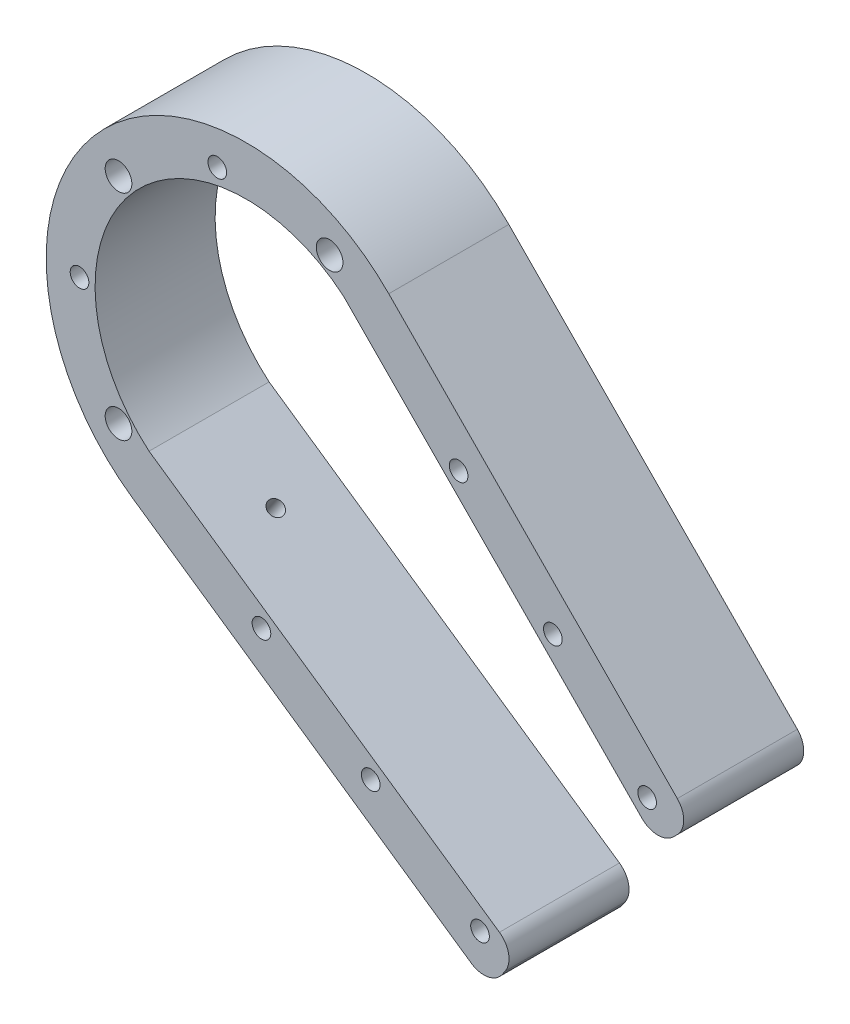
ISO-10303-21;
HEADER;
FILE_DESCRIPTION(('STEP AP214'),'2;1');
FILE_NAME('part.step','',(''),(''),'','','');
FILE_SCHEMA(('AUTOMOTIVE_DESIGN { 1 0 10303 214 1 1 1 1 }'));
ENDSEC;
DATA;
#1=APPLICATION_CONTEXT('core data for automotive mechanical design processes');
#2=APPLICATION_PROTOCOL_DEFINITION('international standard','automotive_design',2000,#1);
#3=PRODUCT_CONTEXT('',#1,'mechanical');
#4=PRODUCT('Part','Part','',(#3));
#5=PRODUCT_RELATED_PRODUCT_CATEGORY('part','',(#4));
#6=PRODUCT_DEFINITION_FORMATION('','',#4);
#7=PRODUCT_DEFINITION_CONTEXT('part definition',#1,'design');
#8=PRODUCT_DEFINITION('design','',#6,#7);
#9=PRODUCT_DEFINITION_SHAPE('','',#8);
#10=(LENGTH_UNIT() NAMED_UNIT(*) SI_UNIT(.MILLI.,.METRE.));
#11=(NAMED_UNIT(*) PLANE_ANGLE_UNIT() SI_UNIT($,.RADIAN.));
#12=(NAMED_UNIT(*) SI_UNIT($,.STERADIAN.) SOLID_ANGLE_UNIT());
#13=UNCERTAINTY_MEASURE_WITH_UNIT(LENGTH_MEASURE(1.E-05),#10,'distance_accuracy_value','');
#14=(GEOMETRIC_REPRESENTATION_CONTEXT(3) GLOBAL_UNCERTAINTY_ASSIGNED_CONTEXT((#13)) GLOBAL_UNIT_ASSIGNED_CONTEXT((#10,
#11,#12)) REPRESENTATION_CONTEXT('',''));
#15=CARTESIAN_POINT('',(0.,0.,0.));
#16=DIRECTION('',(0.,0.,1.));
#17=DIRECTION('',(1.,0.,0.));
#18=AXIS2_PLACEMENT_3D('',#15,#16,#17);
#19=CARTESIAN_POINT('',(18.75,32.4759526419165,9.999));
#20=DIRECTION('',(0.,0.,1.));
#21=DIRECTION('',(1.,0.,0.));
#22=AXIS2_PLACEMENT_3D('',#19,#20,#21);
#23=CYLINDRICAL_SURFACE('',#22,2.1);
#24=CARTESIAN_POINT('',(18.75,32.4759526419165,10.));
#25=DIRECTION('',(0.,0.,1.));
#26=DIRECTION('',(1.,0.,0.));
#27=AXIS2_PLACEMENT_3D('',#24,#25,#26);
#28=CIRCLE('',#27,2.1);
#29=CARTESIAN_POINT('',(20.85,32.4759526419165,10.));
#30=VERTEX_POINT('',#29);
#31=EDGE_CURVE('E273',#30,#30,#28,.F.);
#32=ORIENTED_EDGE('',*,*,#31,.T.);
#33=EDGE_LOOP('',(#32));
#34=FACE_BOUND('',#33,.T.);
#35=CARTESIAN_POINT('',(18.75,32.4759526419165,22.));
#36=DIRECTION('',(0.,0.,1.));
#37=DIRECTION('',(1.,0.,0.));
#38=AXIS2_PLACEMENT_3D('',#35,#36,#37);
#39=CIRCLE('',#38,2.1);
#40=CARTESIAN_POINT('',(20.85,32.4759526419165,22.));
#41=VERTEX_POINT('',#40);
#42=EDGE_CURVE('E45',#41,#41,#39,.F.);
#43=ORIENTED_EDGE('',*,*,#42,.F.);
#44=EDGE_LOOP('',(#43));
#45=FACE_BOUND('',#44,.T.);
#46=ADVANCED_FACE('F41',(#34,#45),#23,.F.);
#47=CARTESIAN_POINT('',(-28.7266666169617,24.1045353632452,9.999));
#48=DIRECTION('',(0.,0.,1.));
#49=DIRECTION('',(1.,0.,0.));
#50=AXIS2_PLACEMENT_3D('',#47,#48,#49);
#51=CYLINDRICAL_SURFACE('',#50,2.1);
#52=CARTESIAN_POINT('',(-28.7266666169617,24.1045353632452,10.));
#53=DIRECTION('',(0.,0.,1.));
#54=DIRECTION('',(1.,0.,0.));
#55=AXIS2_PLACEMENT_3D('',#52,#53,#54);
#56=CIRCLE('',#55,2.1);
#57=CARTESIAN_POINT('',(-26.6266666169617,24.1045353632452,10.));
#58=VERTEX_POINT('',#57);
#59=EDGE_CURVE('E264',#58,#58,#56,.F.);
#60=ORIENTED_EDGE('',*,*,#59,.T.);
#61=EDGE_LOOP('',(#60));
#62=FACE_BOUND('',#61,.T.);
#63=CARTESIAN_POINT('',(-28.7266666169617,24.1045353632452,22.));
#64=DIRECTION('',(0.,0.,1.));
#65=DIRECTION('',(1.,0.,0.));
#66=AXIS2_PLACEMENT_3D('',#63,#64,#65);
#67=CIRCLE('',#66,2.1);
#68=CARTESIAN_POINT('',(-26.6266666169617,24.1045353632452,22.));
#69=VERTEX_POINT('',#68);
#70=EDGE_CURVE('E213',#69,#69,#67,.F.);
#71=ORIENTED_EDGE('',*,*,#70,.F.);
#72=EDGE_LOOP('',(#71));
#73=FACE_BOUND('',#72,.T.);
#74=ADVANCED_FACE('F340',(#62,#73),#51,.F.);
#75=CARTESIAN_POINT('',(-28.7266666169617,-24.1045353632452,9.999));
#76=DIRECTION('',(0.,0.,1.));
#77=DIRECTION('',(1.,0.,0.));
#78=AXIS2_PLACEMENT_3D('',#75,#76,#77);
#79=CYLINDRICAL_SURFACE('',#78,2.1);
#80=CARTESIAN_POINT('',(-28.7266666169617,-24.1045353632452,10.));
#81=DIRECTION('',(0.,0.,1.));
#82=DIRECTION('',(1.,0.,0.));
#83=AXIS2_PLACEMENT_3D('',#80,#81,#82);
#84=CIRCLE('',#83,2.1);
#85=CARTESIAN_POINT('',(-26.6266666169617,-24.1045353632452,10.));
#86=VERTEX_POINT('',#85);
#87=EDGE_CURVE('E255',#86,#86,#84,.F.);
#88=ORIENTED_EDGE('',*,*,#87,.T.);
#89=EDGE_LOOP('',(#88));
#90=FACE_BOUND('',#89,.T.);
#91=CARTESIAN_POINT('',(-28.7266666169617,-24.1045353632452,22.));
#92=DIRECTION('',(0.,0.,1.));
#93=DIRECTION('',(1.,0.,0.));
#94=AXIS2_PLACEMENT_3D('',#91,#92,#93);
#95=CIRCLE('',#94,2.1);
#96=CARTESIAN_POINT('',(-26.6266666169617,-24.1045353632452,22.));
#97=VERTEX_POINT('',#96);
#98=EDGE_CURVE('E211',#97,#97,#95,.F.);
#99=ORIENTED_EDGE('',*,*,#98,.F.);
#100=EDGE_LOOP('',(#99));
#101=FACE_BOUND('',#100,.T.);
#102=ADVANCED_FACE('F347',(#90,#101),#79,.F.);
#103=CARTESIAN_POINT('',(65.0622498431254,67.977292113235,23.5));
#104=DIRECTION('',(-0.567441607867893,-0.823413639467006,0.));
#105=DIRECTION('',(0.823413639467006,-0.567441607867893,0.));
#106=AXIS2_PLACEMENT_3D('',#103,#104,#105);
#107=CYLINDRICAL_SURFACE('',#106,1.7);
#108=CARTESIAN_POINT('',(-6.85529783742989,-36.3821500850441,23.5));
#109=DIRECTION('',(-0.567441607867893,-0.823413639467006,0.));
#110=DIRECTION('',(0.823413639467006,-0.567441607867893,0.));
#111=AXIS2_PLACEMENT_3D('',#108,#109,#110);
#112=CIRCLE('',#111,1.7);
#113=CARTESIAN_POINT('',(-5.45549465033598,-37.3468008184196,23.5));
#114=VERTEX_POINT('',#113);
#115=EDGE_CURVE('E235',#114,#114,#112,.F.);
#116=ORIENTED_EDGE('',*,*,#115,.T.);
#117=EDGE_LOOP('',(#116));
#118=FACE_BOUND('',#117,.T.);
#119=CARTESIAN_POINT('',(-11.4813429384464,-43.0949969756327,23.5));
#120=DIRECTION('',(-0.567441607867893,-0.823413639467006,0.));
#121=DIRECTION('',(0.823413639467006,-0.567441607867893,0.));
#122=AXIS2_PLACEMENT_3D('',#119,#120,#121);
#123=CIRCLE('',#122,1.7);
#124=CARTESIAN_POINT('',(-10.0815397513525,-44.0596477090081,23.5));
#125=VERTEX_POINT('',#124);
#126=EDGE_CURVE('E219',#125,#125,#123,.T.);
#127=ORIENTED_EDGE('',*,*,#126,.T.);
#128=EDGE_LOOP('',(#127));
#129=FACE_BOUND('',#128,.T.);
#130=ADVANCED_FACE('F362',(#118,#129),#107,.F.);
#131=CARTESIAN_POINT('',(0.,0.,37.));
#132=DIRECTION('',(0.,0.,1.));
#133=DIRECTION('',(1.,0.,0.));
#134=AXIS2_PLACEMENT_3D('',#131,#132,#133);
#135=PLANE('',#134);
#136=CARTESIAN_POINT('',(18.75,32.4759526419165,37.));
#137=DIRECTION('',(0.,0.,1.));
#138=DIRECTION('',(1.,0.,0.));
#139=AXIS2_PLACEMENT_3D('',#136,#137,#138);
#140=CIRCLE('',#139,3.);
#141=CARTESIAN_POINT('',(21.75,32.4759526419165,37.));
#142=VERTEX_POINT('',#141);
#143=EDGE_CURVE('E466',#142,#142,#140,.T.);
#144=ORIENTED_EDGE('',*,*,#143,.F.);
#145=EDGE_LOOP('',(#144));
#146=FACE_BOUND('',#145,.T.);
#147=CARTESIAN_POINT('',(-28.7266666169617,24.1045353632452,37.));
#148=DIRECTION('',(0.,0.,1.));
#149=DIRECTION('',(1.,0.,0.));
#150=AXIS2_PLACEMENT_3D('',#147,#148,#149);
#151=CIRCLE('',#150,3.);
#152=CARTESIAN_POINT('',(-25.7266666169617,24.1045353632452,37.));
#153=VERTEX_POINT('',#152);
#154=EDGE_CURVE('E469',#153,#153,#151,.T.);
#155=ORIENTED_EDGE('',*,*,#154,.F.);
#156=EDGE_LOOP('',(#155));
#157=FACE_BOUND('',#156,.T.);
#158=CARTESIAN_POINT('',(-28.7266666169617,-24.1045353632452,37.));
#159=DIRECTION('',(0.,0.,1.));
#160=DIRECTION('',(1.,0.,0.));
#161=AXIS2_PLACEMENT_3D('',#158,#159,#160);
#162=CIRCLE('',#161,3.);
#163=CARTESIAN_POINT('',(-25.7266666169617,-24.1045353632452,37.));
#164=VERTEX_POINT('',#163);
#165=EDGE_CURVE('E476',#164,#164,#162,.T.);
#166=ORIENTED_EDGE('',*,*,#165,.F.);
#167=EDGE_LOOP('',(#166));
#168=FACE_BOUND('',#167,.T.);
#169=CARTESIAN_POINT('',(52.5843615175951,-82.298859012041,37.));
#170=DIRECTION('',(0.,0.,1.));
#171=DIRECTION('',(1.,0.,0.));
#172=AXIS2_PLACEMENT_3D('',#169,#170,#171);
#173=CIRCLE('',#172,2.1);
#174=CARTESIAN_POINT('',(54.6843615175951,-82.298859012041,37.));
#175=VERTEX_POINT('',#174);
#176=EDGE_CURVE('E240',#175,#175,#173,.T.);
#177=ORIENTED_EDGE('',*,*,#176,.F.);
#178=EDGE_LOOP('',(#177));
#179=FACE_BOUND('',#178,.T.);
#180=CARTESIAN_POINT('',(28.0038552032799,-65.1000593640451,37.));
#181=DIRECTION('',(0.,0.,1.));
#182=DIRECTION('',(1.,0.,0.));
#183=AXIS2_PLACEMENT_3D('',#180,#181,#182);
#184=CIRCLE('',#183,2.1);
#185=CARTESIAN_POINT('',(30.1038552032799,-65.1000593640451,37.));
#186=VERTEX_POINT('',#185);
#187=EDGE_CURVE('E243',#186,#186,#184,.T.);
#188=ORIENTED_EDGE('',*,*,#187,.F.);
#189=EDGE_LOOP('',(#188));
#190=FACE_BOUND('',#189,.T.);
#191=CARTESIAN_POINT('',(3.42334888896434,-47.9012597160495,37.));
#192=DIRECTION('',(0.,0.,1.));
#193=DIRECTION('',(1.,0.,0.));
#194=AXIS2_PLACEMENT_3D('',#191,#192,#193);
#195=CIRCLE('',#194,2.1);
#196=CARTESIAN_POINT('',(5.52334888896434,-47.9012597160495,37.));
#197=VERTEX_POINT('',#196);
#198=EDGE_CURVE('E249',#197,#197,#195,.T.);
#199=ORIENTED_EDGE('',*,*,#198,.F.);
#200=EDGE_LOOP('',(#199));
#201=FACE_BOUND('',#200,.T.);
#202=CARTESIAN_POINT('',(-37.5,0.,37.));
#203=DIRECTION('',(0.,0.,1.));
#204=DIRECTION('',(1.,0.,0.));
#205=AXIS2_PLACEMENT_3D('',#202,#203,#204);
#206=CIRCLE('',#205,2.1);
#207=CARTESIAN_POINT('',(-35.4,0.,37.));
#208=VERTEX_POINT('',#207);
#209=EDGE_CURVE('E260',#208,#208,#206,.T.);
#210=ORIENTED_EDGE('',*,*,#209,.F.);
#211=EDGE_LOOP('',(#210));
#212=FACE_BOUND('',#211,.T.);
#213=CARTESIAN_POINT('',(-6.51180666250989,36.9302907379578,37.));
#214=DIRECTION('',(0.,0.,1.));
#215=DIRECTION('',(1.,0.,0.));
#216=AXIS2_PLACEMENT_3D('',#213,#214,#215);
#217=CIRCLE('',#216,2.1);
#218=CARTESIAN_POINT('',(-4.41180666250989,36.9302907379578,37.));
#219=VERTEX_POINT('',#218);
#220=EDGE_CURVE('E269',#219,#219,#217,.T.);
#221=ORIENTED_EDGE('',*,*,#220,.F.);
#222=EDGE_LOOP('',(#221));
#223=FACE_BOUND('',#222,.T.);
#224=CARTESIAN_POINT('',(47.7679902435036,4.94662593052469,37.));
#225=DIRECTION('',(0.,0.,1.));
#226=DIRECTION('',(1.,0.,0.));
#227=AXIS2_PLACEMENT_3D('',#224,#225,#226);
#228=CIRCLE('',#227,2.1);
#229=CARTESIAN_POINT('',(49.8679902435036,4.94662593052469,37.));
#230=VERTEX_POINT('',#229);
#231=EDGE_CURVE('E278',#230,#230,#228,.T.);
#232=ORIENTED_EDGE('',*,*,#231,.F.);
#233=EDGE_LOOP('',(#232));
#234=FACE_BOUND('',#233,.T.);
#235=CARTESIAN_POINT('',(68.9738616069648,-16.2739070438456,37.));
#236=DIRECTION('',(0.,0.,1.));
#237=DIRECTION('',(1.,0.,0.));
#238=AXIS2_PLACEMENT_3D('',#235,#236,#237);
#239=CIRCLE('',#238,2.1);
#240=CARTESIAN_POINT('',(71.0738616069648,-16.2739070438456,37.));
#241=VERTEX_POINT('',#240);
#242=EDGE_CURVE('E282',#241,#241,#239,.T.);
#243=ORIENTED_EDGE('',*,*,#242,.F.);
#244=EDGE_LOOP('',(#243));
#245=FACE_BOUND('',#244,.T.);
#246=CARTESIAN_POINT('',(90.1797329704259,-37.4944400182162,37.));
#247=DIRECTION('',(0.,0.,1.));
#248=DIRECTION('',(1.,0.,0.));
#249=AXIS2_PLACEMENT_3D('',#246,#247,#248);
#250=CIRCLE('',#249,2.1);
#251=CARTESIAN_POINT('',(92.2797329704259,-37.4944400182162,37.));
#252=VERTEX_POINT('',#251);
#253=EDGE_CURVE('E288',#252,#252,#250,.T.);
#254=ORIENTED_EDGE('',*,*,#253,.F.);
#255=EDGE_LOOP('',(#254));
#256=FACE_BOUND('',#255,.T.);
#257=CARTESIAN_POINT('',(0.,0.,37.));
#258=DIRECTION('',(0.,0.,1.));
#259=DIRECTION('',(1.,0.,0.));
#260=AXIS2_PLACEMENT_3D('',#257,#258,#259);
#261=CIRCLE('',#260,45.);
#262=CARTESIAN_POINT('',(32.0566020725005,31.5812327746298,37.));
#263=VERTEX_POINT('',#262);
#264=CARTESIAN_POINT('',(-25.5348723540551,-37.0536137760153,37.));
#265=VERTEX_POINT('',#264);
#266=EDGE_CURVE('E187',#263,#265,#261,.T.);
#267=ORIENTED_EDGE('',*,*,#266,.T.);
#268=DIRECTION('',(0.823413639467006,-0.567441607867893,0.));
#269=VECTOR('',#268,1.);
#270=CARTESIAN_POINT('',(-25.5348723540551,-37.0536137760153,37.));
#271=LINE('',#270,#269);
#272=CARTESIAN_POINT('',(50.6195975492525,-89.5341809867209,37.));
#273=VERTEX_POINT('',#272);
#274=EDGE_CURVE('E115',#265,#273,#271,.T.);
#275=ORIENTED_EDGE('',*,*,#274,.T.);
#276=CARTESIAN_POINT('',(53.456805588592,-85.4171127893859,37.));
#277=DIRECTION('',(0.,0.,1.));
#278=DIRECTION('',(1.,0.,0.));
#279=AXIS2_PLACEMENT_3D('',#276,#277,#278);
#280=CIRCLE('',#279,5.);
#281=CARTESIAN_POINT('',(57.573873785927,-88.2543208287254,37.));
#282=VERTEX_POINT('',#281);
#283=EDGE_CURVE('E297',#273,#282,#280,.T.);
#284=ORIENTED_EDGE('',*,*,#283,.T.);
#285=DIRECTION('',(0.567441607867889,0.823413639467008,0.));
#286=VECTOR('',#285,1.);
#287=CARTESIAN_POINT('',(58.2278276318683,-87.3053694144059,37.));
#288=LINE('',#287,#286);
#289=CARTESIAN_POINT('',(58.2278276318683,-87.3053694144059,37.));
#290=VERTEX_POINT('',#289);
#291=EDGE_CURVE('E299',#282,#290,#288,.T.);
#292=ORIENTED_EDGE('',*,*,#291,.T.);
#293=CARTESIAN_POINT('',(54.1107594345333,-84.4681613750665,37.));
#294=DIRECTION('',(0.,0.,1.));
#295=DIRECTION('',(-1.,0.,0.));
#296=AXIS2_PLACEMENT_3D('',#293,#294,#295);
#297=CIRCLE('',#296,5.);
#298=CARTESIAN_POINT('',(56.9479674738727,-80.3510931777314,37.));
#299=VERTEX_POINT('',#298);
#300=EDGE_CURVE('E301',#290,#299,#297,.T.);
#301=ORIENTED_EDGE('',*,*,#300,.T.);
#302=DIRECTION('',(-0.823413639467006,0.567441607867893,0.));
#303=VECTOR('',#302,1.);
#304=CARTESIAN_POINT('',(-21.8547787293424,-26.0455110660452,37.));
#305=LINE('',#304,#303);
#306=CARTESIAN_POINT('',(-21.8547787293424,-26.0455110660452,37.));
#307=VERTEX_POINT('',#306);
#308=EDGE_CURVE('E303',#299,#307,#305,.T.);
#309=ORIENTED_EDGE('',*,*,#308,.T.);
#310=CARTESIAN_POINT('',(0.,0.,37.));
#311=DIRECTION('',(0.,0.,-1.));
#312=DIRECTION('',(1.,0.,0.));
#313=AXIS2_PLACEMENT_3D('',#310,#311,#312);
#314=CIRCLE('',#313,34.);
#315=CARTESIAN_POINT('',(21.8547787293424,26.0455110660452,37.));
#316=VERTEX_POINT('',#315);
#317=EDGE_CURVE('E305',#307,#316,#314,.T.);
#318=ORIENTED_EDGE('',*,*,#317,.T.);
#319=DIRECTION('',(0.701805172769552,-0.712368934944456,0.));
#320=VECTOR('',#319,1.);
#321=CARTESIAN_POINT('',(21.8547787293424,26.0455110660452,37.));
#322=LINE('',#321,#320);
#323=CARTESIAN_POINT('',(89.0192902981097,-42.1299789826984,37.));
#324=VERTEX_POINT('',#323);
#325=EDGE_CURVE('E307',#316,#324,#322,.T.);
#326=ORIENTED_EDGE('',*,*,#325,.T.);
#327=CARTESIAN_POINT('',(92.581134972832,-38.6209531188506,37.));
#328=DIRECTION('',(0.,0.,1.));
#329=DIRECTION('',(1.,0.,0.));
#330=AXIS2_PLACEMENT_3D('',#327,#328,#329);
#331=CIRCLE('',#330,5.);
#332=CARTESIAN_POINT('',(96.0901608366797,-42.1827977935729,37.));
#333=VERTEX_POINT('',#332);
#334=EDGE_CURVE('E146',#324,#333,#331,.T.);
#335=ORIENTED_EDGE('',*,*,#334,.T.);
#336=DIRECTION('',(0.712368934944457,0.701805172769552,0.));
#337=VECTOR('',#336,1.);
#338=CARTESIAN_POINT('',(96.9111376531075,-41.3739952921868,37.));
#339=LINE('',#338,#337);
#340=CARTESIAN_POINT('',(96.9111376531075,-41.3739952921867,37.));
#341=VERTEX_POINT('',#340);
#342=EDGE_CURVE('E140',#333,#341,#339,.T.);
#343=ORIENTED_EDGE('',*,*,#342,.T.);
#344=CARTESIAN_POINT('',(93.4021117892597,-37.8121506174645,37.));
#345=DIRECTION('',(0.,0.,1.));
#346=DIRECTION('',(1.,0.,0.));
#347=AXIS2_PLACEMENT_3D('',#344,#345,#346);
#348=CIRCLE('',#347,5.);
#349=CARTESIAN_POINT('',(96.963956463982,-34.3031247536167,37.));
#350=VERTEX_POINT('',#349);
#351=EDGE_CURVE('E144',#341,#350,#348,.T.);
#352=ORIENTED_EDGE('',*,*,#351,.T.);
#353=DIRECTION('',(-0.701805172769552,0.712368934944456,0.));
#354=VECTOR('',#353,1.);
#355=CARTESIAN_POINT('',(32.0566020725005,31.5812327746298,37.));
#356=LINE('',#355,#354);
#357=EDGE_CURVE('E60',#350,#263,#356,.T.);
#358=ORIENTED_EDGE('',*,*,#357,.T.);
#359=EDGE_LOOP('',(#267,#275,#284,#292,#301,#309,#318,#326,#335,#343,#352,#358));
#360=FACE_BOUND('',#359,.T.);
#361=ADVANCED_FACE('F142',(#146,#157,#168,#179,#190,#201,#212,#223,#234,#245,#256,#360),#135,.T.);
#362=CARTESIAN_POINT('',(0.,0.,10.));
#363=DIRECTION('',(0.,0.,1.));
#364=DIRECTION('',(1.,0.,0.));
#365=AXIS2_PLACEMENT_3D('',#362,#363,#364);
#366=PLANE('',#365);
#367=CARTESIAN_POINT('',(52.5843615175951,-82.298859012041,10.));
#368=DIRECTION('',(0.,0.,1.));
#369=DIRECTION('',(1.,0.,0.));
#370=AXIS2_PLACEMENT_3D('',#367,#368,#369);
#371=CIRCLE('',#370,2.1);
#372=CARTESIAN_POINT('',(54.6843615175951,-82.298859012041,10.));
#373=VERTEX_POINT('',#372);
#374=EDGE_CURVE('E168',#373,#373,#371,.F.);
#375=ORIENTED_EDGE('',*,*,#374,.F.);
#376=EDGE_LOOP('',(#375));
#377=FACE_BOUND('',#376,.T.);
#378=CARTESIAN_POINT('',(28.0038552032799,-65.1000593640451,10.));
#379=DIRECTION('',(0.,0.,1.));
#380=DIRECTION('',(1.,0.,0.));
#381=AXIS2_PLACEMENT_3D('',#378,#379,#380);
#382=CIRCLE('',#381,2.1);
#383=CARTESIAN_POINT('',(30.1038552032799,-65.1000593640451,10.));
#384=VERTEX_POINT('',#383);
#385=EDGE_CURVE('E246',#384,#384,#382,.F.);
#386=ORIENTED_EDGE('',*,*,#385,.F.);
#387=EDGE_LOOP('',(#386));
#388=FACE_BOUND('',#387,.T.);
#389=CARTESIAN_POINT('',(3.42334888896434,-47.9012597160495,10.));
#390=DIRECTION('',(0.,0.,1.));
#391=DIRECTION('',(1.,0.,0.));
#392=AXIS2_PLACEMENT_3D('',#389,#390,#391);
#393=CIRCLE('',#392,2.1);
#394=CARTESIAN_POINT('',(5.52334888896434,-47.9012597160495,10.));
#395=VERTEX_POINT('',#394);
#396=EDGE_CURVE('E252',#395,#395,#393,.F.);
#397=ORIENTED_EDGE('',*,*,#396,.F.);
#398=EDGE_LOOP('',(#397));
#399=FACE_BOUND('',#398,.T.);
#400=ORIENTED_EDGE('',*,*,#87,.F.);
#401=EDGE_LOOP('',(#400));
#402=FACE_BOUND('',#401,.T.);
#403=CARTESIAN_POINT('',(-37.5,0.,10.));
#404=DIRECTION('',(0.,0.,1.));
#405=DIRECTION('',(1.,0.,0.));
#406=AXIS2_PLACEMENT_3D('',#403,#404,#405);
#407=CIRCLE('',#406,2.1);
#408=CARTESIAN_POINT('',(-35.4,0.,10.));
#409=VERTEX_POINT('',#408);
#410=EDGE_CURVE('E261',#409,#409,#407,.F.);
#411=ORIENTED_EDGE('',*,*,#410,.F.);
#412=EDGE_LOOP('',(#411));
#413=FACE_BOUND('',#412,.T.);
#414=ORIENTED_EDGE('',*,*,#59,.F.);
#415=EDGE_LOOP('',(#414));
#416=FACE_BOUND('',#415,.T.);
#417=CARTESIAN_POINT('',(-6.51180666250989,36.9302907379578,10.));
#418=DIRECTION('',(0.,0.,1.));
#419=DIRECTION('',(1.,0.,0.));
#420=AXIS2_PLACEMENT_3D('',#417,#418,#419);
#421=CIRCLE('',#420,2.1);
#422=CARTESIAN_POINT('',(-4.41180666250989,36.9302907379578,10.));
#423=VERTEX_POINT('',#422);
#424=EDGE_CURVE('E270',#423,#423,#421,.F.);
#425=ORIENTED_EDGE('',*,*,#424,.F.);
#426=EDGE_LOOP('',(#425));
#427=FACE_BOUND('',#426,.T.);
#428=ORIENTED_EDGE('',*,*,#31,.F.);
#429=EDGE_LOOP('',(#428));
#430=FACE_BOUND('',#429,.T.);
#431=CARTESIAN_POINT('',(47.7679902435036,4.94662593052469,10.));
#432=DIRECTION('',(0.,0.,1.));
#433=DIRECTION('',(1.,0.,0.));
#434=AXIS2_PLACEMENT_3D('',#431,#432,#433);
#435=CIRCLE('',#434,2.1);
#436=CARTESIAN_POINT('',(49.8679902435036,4.94662593052469,10.));
#437=VERTEX_POINT('',#436);
#438=EDGE_CURVE('E279',#437,#437,#435,.F.);
#439=ORIENTED_EDGE('',*,*,#438,.F.);
#440=EDGE_LOOP('',(#439));
#441=FACE_BOUND('',#440,.T.);
#442=CARTESIAN_POINT('',(68.9738616069648,-16.2739070438456,10.));
#443=DIRECTION('',(0.,0.,1.));
#444=DIRECTION('',(1.,0.,0.));
#445=AXIS2_PLACEMENT_3D('',#442,#443,#444);
#446=CIRCLE('',#445,2.1);
#447=CARTESIAN_POINT('',(71.0738616069648,-16.2739070438456,10.));
#448=VERTEX_POINT('',#447);
#449=EDGE_CURVE('E285',#448,#448,#446,.F.);
#450=ORIENTED_EDGE('',*,*,#449,.F.);
#451=EDGE_LOOP('',(#450));
#452=FACE_BOUND('',#451,.T.);
#453=CARTESIAN_POINT('',(90.1797329704259,-37.4944400182162,10.));
#454=DIRECTION('',(0.,0.,1.));
#455=DIRECTION('',(1.,0.,0.));
#456=AXIS2_PLACEMENT_3D('',#453,#454,#455);
#457=CIRCLE('',#456,2.1);
#458=CARTESIAN_POINT('',(92.2797329704259,-37.4944400182162,10.));
#459=VERTEX_POINT('',#458);
#460=EDGE_CURVE('E239',#459,#459,#457,.F.);
#461=ORIENTED_EDGE('',*,*,#460,.F.);
#462=EDGE_LOOP('',(#461));
#463=FACE_BOUND('',#462,.T.);
#464=CARTESIAN_POINT('',(0.,0.,10.));
#465=DIRECTION('',(0.,0.,1.));
#466=DIRECTION('',(1.,0.,0.));
#467=AXIS2_PLACEMENT_3D('',#464,#465,#466);
#468=CIRCLE('',#467,45.);
#469=CARTESIAN_POINT('',(32.0566020725005,31.5812327746298,10.));
#470=VERTEX_POINT('',#469);
#471=CARTESIAN_POINT('',(-25.5348723540551,-37.0536137760153,10.));
#472=VERTEX_POINT('',#471);
#473=EDGE_CURVE('E164',#470,#472,#468,.T.);
#474=ORIENTED_EDGE('',*,*,#473,.F.);
#475=DIRECTION('',(-0.701805172769552,0.712368934944456,0.));
#476=VECTOR('',#475,1.);
#477=CARTESIAN_POINT('',(32.0566020725005,31.5812327746298,10.));
#478=LINE('',#477,#476);
#479=CARTESIAN_POINT('',(96.963956463982,-34.3031247536167,10.));
#480=VERTEX_POINT('',#479);
#481=EDGE_CURVE('E107',#480,#470,#478,.T.);
#482=ORIENTED_EDGE('',*,*,#481,.F.);
#483=CARTESIAN_POINT('',(93.4021117892597,-37.8121506174645,10.));
#484=DIRECTION('',(0.,0.,1.));
#485=DIRECTION('',(1.,0.,0.));
#486=AXIS2_PLACEMENT_3D('',#483,#484,#485);
#487=CIRCLE('',#486,5.);
#488=CARTESIAN_POINT('',(96.9111376531075,-41.3739952921867,10.));
#489=VERTEX_POINT('',#488);
#490=EDGE_CURVE('E101',#489,#480,#487,.T.);
#491=ORIENTED_EDGE('',*,*,#490,.F.);
#492=DIRECTION('',(0.712368934944457,0.701805172769552,0.));
#493=VECTOR('',#492,1.);
#494=CARTESIAN_POINT('',(96.9111376531075,-41.3739952921868,10.));
#495=LINE('',#494,#493);
#496=CARTESIAN_POINT('',(96.0901608366797,-42.1827977935729,10.));
#497=VERTEX_POINT('',#496);
#498=EDGE_CURVE('E154',#497,#489,#495,.T.);
#499=ORIENTED_EDGE('',*,*,#498,.F.);
#500=CARTESIAN_POINT('',(92.581134972832,-38.6209531188506,10.));
#501=DIRECTION('',(0.,0.,1.));
#502=DIRECTION('',(1.,0.,0.));
#503=AXIS2_PLACEMENT_3D('',#500,#501,#502);
#504=CIRCLE('',#503,5.);
#505=CARTESIAN_POINT('',(89.0192902981097,-42.1299789826984,10.));
#506=VERTEX_POINT('',#505);
#507=EDGE_CURVE('E182',#506,#497,#504,.T.);
#508=ORIENTED_EDGE('',*,*,#507,.F.);
#509=DIRECTION('',(0.701805172769552,-0.712368934944456,0.));
#510=VECTOR('',#509,1.);
#511=CARTESIAN_POINT('',(21.8547787293424,26.0455110660452,10.));
#512=LINE('',#511,#510);
#513=CARTESIAN_POINT('',(21.8547787293424,26.0455110660452,10.));
#514=VERTEX_POINT('',#513);
#515=EDGE_CURVE('E180',#514,#506,#512,.T.);
#516=ORIENTED_EDGE('',*,*,#515,.F.);
#517=CARTESIAN_POINT('',(0.,0.,10.));
#518=DIRECTION('',(0.,0.,-1.));
#519=DIRECTION('',(1.,0.,0.));
#520=AXIS2_PLACEMENT_3D('',#517,#518,#519);
#521=CIRCLE('',#520,34.);
#522=CARTESIAN_POINT('',(-21.8547787293424,-26.0455110660452,10.));
#523=VERTEX_POINT('',#522);
#524=EDGE_CURVE('E178',#523,#514,#521,.T.);
#525=ORIENTED_EDGE('',*,*,#524,.F.);
#526=DIRECTION('',(-0.823413639467006,0.567441607867893,0.));
#527=VECTOR('',#526,1.);
#528=CARTESIAN_POINT('',(-21.8547787293424,-26.0455110660452,10.));
#529=LINE('',#528,#527);
#530=CARTESIAN_POINT('',(56.9479674738727,-80.3510931777314,10.));
#531=VERTEX_POINT('',#530);
#532=EDGE_CURVE('E176',#531,#523,#529,.T.);
#533=ORIENTED_EDGE('',*,*,#532,.F.);
#534=CARTESIAN_POINT('',(54.1107594345333,-84.4681613750665,10.));
#535=DIRECTION('',(0.,0.,1.));
#536=DIRECTION('',(-1.,0.,0.));
#537=AXIS2_PLACEMENT_3D('',#534,#535,#536);
#538=CIRCLE('',#537,5.);
#539=CARTESIAN_POINT('',(58.2278276318683,-87.3053694144059,10.));
#540=VERTEX_POINT('',#539);
#541=EDGE_CURVE('E174',#540,#531,#538,.T.);
#542=ORIENTED_EDGE('',*,*,#541,.F.);
#543=DIRECTION('',(0.567441607867889,0.823413639467008,0.));
#544=VECTOR('',#543,1.);
#545=CARTESIAN_POINT('',(58.2278276318683,-87.3053694144059,10.));
#546=LINE('',#545,#544);
#547=CARTESIAN_POINT('',(57.573873785927,-88.2543208287254,10.));
#548=VERTEX_POINT('',#547);
#549=EDGE_CURVE('E172',#548,#540,#546,.T.);
#550=ORIENTED_EDGE('',*,*,#549,.F.);
#551=CARTESIAN_POINT('',(53.456805588592,-85.4171127893859,10.));
#552=DIRECTION('',(0.,0.,1.));
#553=DIRECTION('',(1.,0.,0.));
#554=AXIS2_PLACEMENT_3D('',#551,#552,#553);
#555=CIRCLE('',#554,5.);
#556=CARTESIAN_POINT('',(50.6195975492525,-89.5341809867209,10.));
#557=VERTEX_POINT('',#556);
#558=EDGE_CURVE('E170',#557,#548,#555,.T.);
#559=ORIENTED_EDGE('',*,*,#558,.F.);
#560=DIRECTION('',(0.823413639467006,-0.567441607867893,0.));
#561=VECTOR('',#560,1.);
#562=CARTESIAN_POINT('',(-25.5348723540551,-37.0536137760153,10.));
#563=LINE('',#562,#561);
#564=EDGE_CURVE('E167',#472,#557,#563,.T.);
#565=ORIENTED_EDGE('',*,*,#564,.F.);
#566=EDGE_LOOP('',(#474,#482,#491,#499,#508,#516,#525,#533,#542,#550,#559,#565));
#567=FACE_BOUND('',#566,.T.);
#568=ADVANCED_FACE('F320',(#377,#388,#399,#402,#413,#416,#427,#430,#441,#452,#463,#567),#366,.F.);
#569=CARTESIAN_POINT('',(0.,0.,37.));
#570=DIRECTION('',(0.,0.,-1.));
#571=DIRECTION('',(-1.,0.,0.));
#572=AXIS2_PLACEMENT_3D('',#569,#570,#571);
#573=CYLINDRICAL_SURFACE('',#572,45.);
#574=ORIENTED_EDGE('',*,*,#473,.T.);
#575=DIRECTION('',(0.,0.,-1.));
#576=VECTOR('',#575,1.);
#577=CARTESIAN_POINT('',(-25.5348723540551,-37.0536137760153,37.));
#578=LINE('',#577,#576);
#579=EDGE_CURVE('E12',#265,#472,#578,.T.);
#580=ORIENTED_EDGE('',*,*,#579,.F.);
#581=ORIENTED_EDGE('',*,*,#266,.F.);
#582=DIRECTION('',(0.,0.,-1.));
#583=VECTOR('',#582,1.);
#584=CARTESIAN_POINT('',(32.0566020725005,31.5812327746298,37.));
#585=LINE('',#584,#583);
#586=EDGE_CURVE('E160',#263,#470,#585,.T.);
#587=ORIENTED_EDGE('',*,*,#586,.T.);
#588=EDGE_LOOP('',(#574,#580,#581,#587));
#589=FACE_BOUND('',#588,.T.);
#590=ADVANCED_FACE('F43',(#589),#573,.T.);
#591=CARTESIAN_POINT('',(-25.5348723540551,-37.0536137760153,37.));
#592=DIRECTION('',(0.567441607867893,0.823413639467006,0.));
#593=DIRECTION('',(-0.823413639467006,0.567441607867893,0.));
#594=AXIS2_PLACEMENT_3D('',#591,#592,#593);
#595=PLANE('',#594);
#596=CARTESIAN_POINT('',(-13.1836677620501,-45.5652378940337,23.5));
#597=DIRECTION('',(-0.567441607867893,-0.823413639467006,0.));
#598=DIRECTION('',(0.823413639467006,-0.567441607867893,0.));
#599=AXIS2_PLACEMENT_3D('',#596,#597,#598);
#600=CIRCLE('',#599,3.);
#601=CARTESIAN_POINT('',(-10.7134268436491,-47.2675627176374,23.5));
#602=VERTEX_POINT('',#601);
#603=EDGE_CURVE('E223',#602,#602,#600,.T.);
#604=ORIENTED_EDGE('',*,*,#603,.F.);
#605=EDGE_LOOP('',(#604));
#606=FACE_BOUND('',#605,.T.);
#607=ORIENTED_EDGE('',*,*,#564,.T.);
#608=DIRECTION('',(0.,0.,-1.));
#609=VECTOR('',#608,1.);
#610=CARTESIAN_POINT('',(50.6195975492525,-89.5341809867209,37.));
#611=LINE('',#610,#609);
#612=EDGE_CURVE('E51',#273,#557,#611,.T.);
#613=ORIENTED_EDGE('',*,*,#612,.F.);
#614=ORIENTED_EDGE('',*,*,#274,.F.);
#615=ORIENTED_EDGE('',*,*,#579,.T.);
#616=EDGE_LOOP('',(#607,#613,#614,#615));
#617=FACE_BOUND('',#616,.T.);
#618=ADVANCED_FACE('F368',(#606,#617),#595,.F.);
#619=CARTESIAN_POINT('',(53.456805588592,-85.4171127893859,37.));
#620=DIRECTION('',(0.,0.,-1.));
#621=DIRECTION('',(-1.,0.,0.));
#622=AXIS2_PLACEMENT_3D('',#619,#620,#621);
#623=CYLINDRICAL_SURFACE('',#622,5.);
#624=ORIENTED_EDGE('',*,*,#558,.T.);
#625=DIRECTION('',(0.,0.,-1.));
#626=VECTOR('',#625,1.);
#627=CARTESIAN_POINT('',(57.573873785927,-88.2543208287254,37.));
#628=LINE('',#627,#626);
#629=EDGE_CURVE('E206',#282,#548,#628,.T.);
#630=ORIENTED_EDGE('',*,*,#629,.F.);
#631=ORIENTED_EDGE('',*,*,#283,.F.);
#632=ORIENTED_EDGE('',*,*,#612,.T.);
#633=EDGE_LOOP('',(#624,#630,#631,#632));
#634=FACE_BOUND('',#633,.T.);
#635=ADVANCED_FACE('F668',(#634),#623,.T.);
#636=CARTESIAN_POINT('',(58.2278276318683,-87.3053694144059,37.));
#637=DIRECTION('',(-0.823413639467008,0.567441607867889,0.));
#638=DIRECTION('',(-0.567441607867889,-0.823413639467008,0.));
#639=AXIS2_PLACEMENT_3D('',#636,#637,#638);
#640=PLANE('',#639);
#641=ORIENTED_EDGE('',*,*,#549,.T.);
#642=DIRECTION('',(0.,0.,-1.));
#643=VECTOR('',#642,1.);
#644=CARTESIAN_POINT('',(58.2278276318683,-87.3053694144059,37.));
#645=LINE('',#644,#643);
#646=EDGE_CURVE('E203',#290,#540,#645,.T.);
#647=ORIENTED_EDGE('',*,*,#646,.F.);
#648=ORIENTED_EDGE('',*,*,#291,.F.);
#649=ORIENTED_EDGE('',*,*,#629,.T.);
#650=EDGE_LOOP('',(#641,#647,#648,#649));
#651=FACE_BOUND('',#650,.T.);
#652=ADVANCED_FACE('F659',(#651),#640,.F.);
#653=CARTESIAN_POINT('',(54.1107594345333,-84.4681613750665,37.));
#654=DIRECTION('',(0.,0.,-1.));
#655=DIRECTION('',(-1.,0.,0.));
#656=AXIS2_PLACEMENT_3D('',#653,#654,#655);
#657=CYLINDRICAL_SURFACE('',#656,5.);
#658=ORIENTED_EDGE('',*,*,#541,.T.);
#659=DIRECTION('',(0.,0.,-1.));
#660=VECTOR('',#659,1.);
#661=CARTESIAN_POINT('',(56.9479674738727,-80.3510931777314,37.));
#662=LINE('',#661,#660);
#663=EDGE_CURVE('E200',#299,#531,#662,.T.);
#664=ORIENTED_EDGE('',*,*,#663,.F.);
#665=ORIENTED_EDGE('',*,*,#300,.F.);
#666=ORIENTED_EDGE('',*,*,#646,.T.);
#667=EDGE_LOOP('',(#658,#664,#665,#666));
#668=FACE_BOUND('',#667,.T.);
#669=ADVANCED_FACE('F650',(#668),#657,.T.);
#670=CARTESIAN_POINT('',(-21.8547787293424,-26.0455110660452,37.));
#671=DIRECTION('',(-0.567441607867893,-0.823413639467006,0.));
#672=DIRECTION('',(0.823413639467006,-0.567441607867893,0.));
#673=AXIS2_PLACEMENT_3D('',#670,#671,#672);
#674=PLANE('',#673);
#675=ORIENTED_EDGE('',*,*,#115,.F.);
#676=EDGE_LOOP('',(#675));
#677=FACE_BOUND('',#676,.T.);
#678=ORIENTED_EDGE('',*,*,#532,.T.);
#679=DIRECTION('',(0.,0.,-1.));
#680=VECTOR('',#679,1.);
#681=CARTESIAN_POINT('',(-21.8547787293424,-26.0455110660452,37.));
#682=LINE('',#681,#680);
#683=EDGE_CURVE('E197',#307,#523,#682,.T.);
#684=ORIENTED_EDGE('',*,*,#683,.F.);
#685=ORIENTED_EDGE('',*,*,#308,.F.);
#686=ORIENTED_EDGE('',*,*,#663,.T.);
#687=EDGE_LOOP('',(#678,#684,#685,#686));
#688=FACE_BOUND('',#687,.T.);
#689=ADVANCED_FACE('F642',(#677,#688),#674,.F.);
#690=CARTESIAN_POINT('',(0.,0.,37.));
#691=DIRECTION('',(0.,0.,-1.));
#692=DIRECTION('',(-1.,0.,0.));
#693=AXIS2_PLACEMENT_3D('',#690,#691,#692);
#694=CYLINDRICAL_SURFACE('',#693,34.);
#695=ORIENTED_EDGE('',*,*,#524,.T.);
#696=DIRECTION('',(0.,0.,-1.));
#697=VECTOR('',#696,1.);
#698=CARTESIAN_POINT('',(21.8547787293424,26.0455110660452,37.));
#699=LINE('',#698,#697);
#700=EDGE_CURVE('E194',#316,#514,#699,.T.);
#701=ORIENTED_EDGE('',*,*,#700,.F.);
#702=ORIENTED_EDGE('',*,*,#317,.F.);
#703=ORIENTED_EDGE('',*,*,#683,.T.);
#704=EDGE_LOOP('',(#695,#701,#702,#703));
#705=FACE_BOUND('',#704,.T.);
#706=ADVANCED_FACE('F634',(#705),#694,.F.);
#707=CARTESIAN_POINT('',(21.8547787293424,26.0455110660452,37.));
#708=DIRECTION('',(0.712368934944456,0.701805172769552,0.));
#709=DIRECTION('',(-0.701805172769552,0.712368934944456,0.));
#710=AXIS2_PLACEMENT_3D('',#707,#708,#709);
#711=PLANE('',#710);
#712=ORIENTED_EDGE('',*,*,#515,.T.);
#713=DIRECTION('',(0.,0.,-1.));
#714=VECTOR('',#713,1.);
#715=CARTESIAN_POINT('',(89.0192902981097,-42.1299789826984,37.));
#716=LINE('',#715,#714);
#717=EDGE_CURVE('E191',#324,#506,#716,.T.);
#718=ORIENTED_EDGE('',*,*,#717,.F.);
#719=ORIENTED_EDGE('',*,*,#325,.F.);
#720=ORIENTED_EDGE('',*,*,#700,.T.);
#721=EDGE_LOOP('',(#712,#718,#719,#720));
#722=FACE_BOUND('',#721,.T.);
#723=ADVANCED_FACE('F313',(#722),#711,.F.);
#724=CARTESIAN_POINT('',(92.581134972832,-38.6209531188506,37.));
#725=DIRECTION('',(0.,0.,-1.));
#726=DIRECTION('',(-1.,0.,0.));
#727=AXIS2_PLACEMENT_3D('',#724,#725,#726);
#728=CYLINDRICAL_SURFACE('',#727,5.);
#729=ORIENTED_EDGE('',*,*,#507,.T.);
#730=DIRECTION('',(0.,0.,-1.));
#731=VECTOR('',#730,1.);
#732=CARTESIAN_POINT('',(96.0901608366797,-42.1827977935729,37.));
#733=LINE('',#732,#731);
#734=EDGE_CURVE('E155',#333,#497,#733,.T.);
#735=ORIENTED_EDGE('',*,*,#734,.F.);
#736=ORIENTED_EDGE('',*,*,#334,.F.);
#737=ORIENTED_EDGE('',*,*,#717,.T.);
#738=EDGE_LOOP('',(#729,#735,#736,#737));
#739=FACE_BOUND('',#738,.T.);
#740=ADVANCED_FACE('F317',(#739),#728,.T.);
#741=CARTESIAN_POINT('',(96.9111376531075,-41.3739952921868,37.));
#742=DIRECTION('',(-0.701805172769552,0.712368934944457,0.));
#743=DIRECTION('',(-0.712368934944457,-0.701805172769552,0.));
#744=AXIS2_PLACEMENT_3D('',#741,#742,#743);
#745=PLANE('',#744);
#746=ORIENTED_EDGE('',*,*,#498,.T.);
#747=DIRECTION('',(0.,0.,-1.));
#748=VECTOR('',#747,1.);
#749=CARTESIAN_POINT('',(96.9111376531075,-41.3739952921867,37.));
#750=LINE('',#749,#748);
#751=EDGE_CURVE('E151',#341,#489,#750,.T.);
#752=ORIENTED_EDGE('',*,*,#751,.F.);
#753=ORIENTED_EDGE('',*,*,#342,.F.);
#754=ORIENTED_EDGE('',*,*,#734,.T.);
#755=EDGE_LOOP('',(#746,#752,#753,#754));
#756=FACE_BOUND('',#755,.T.);
#757=ADVANCED_FACE('F152',(#756),#745,.F.);
#758=CARTESIAN_POINT('',(93.4021117892597,-37.8121506174645,37.));
#759=DIRECTION('',(0.,0.,-1.));
#760=DIRECTION('',(-1.,0.,0.));
#761=AXIS2_PLACEMENT_3D('',#758,#759,#760);
#762=CYLINDRICAL_SURFACE('',#761,5.);
#763=ORIENTED_EDGE('',*,*,#490,.T.);
#764=DIRECTION('',(0.,0.,-1.));
#765=VECTOR('',#764,1.);
#766=CARTESIAN_POINT('',(96.963956463982,-34.3031247536167,37.));
#767=LINE('',#766,#765);
#768=EDGE_CURVE('E156',#350,#480,#767,.T.);
#769=ORIENTED_EDGE('',*,*,#768,.F.);
#770=ORIENTED_EDGE('',*,*,#351,.F.);
#771=ORIENTED_EDGE('',*,*,#751,.T.);
#772=EDGE_LOOP('',(#763,#769,#770,#771));
#773=FACE_BOUND('',#772,.T.);
#774=ADVANCED_FACE('F158',(#773),#762,.T.);
#775=CARTESIAN_POINT('',(32.0566020725005,31.5812327746298,37.));
#776=DIRECTION('',(-0.712368934944456,-0.701805172769552,0.));
#777=DIRECTION('',(0.701805172769552,-0.712368934944456,0.));
#778=AXIS2_PLACEMENT_3D('',#775,#776,#777);
#779=PLANE('',#778);
#780=ORIENTED_EDGE('',*,*,#481,.T.);
#781=ORIENTED_EDGE('',*,*,#586,.F.);
#782=ORIENTED_EDGE('',*,*,#357,.F.);
#783=ORIENTED_EDGE('',*,*,#768,.T.);
#784=EDGE_LOOP('',(#780,#781,#782,#783));
#785=FACE_BOUND('',#784,.T.);
#786=ADVANCED_FACE('F325',(#785),#779,.F.);
#787=CARTESIAN_POINT('',(90.1797329704259,-37.4944400182162,9.999));
#788=DIRECTION('',(0.,0.,1.));
#789=DIRECTION('',(1.,0.,0.));
#790=AXIS2_PLACEMENT_3D('',#787,#788,#789);
#791=CYLINDRICAL_SURFACE('',#790,2.1);
#792=ORIENTED_EDGE('',*,*,#253,.T.);
#793=EDGE_LOOP('',(#792));
#794=FACE_BOUND('',#793,.T.);
#795=ORIENTED_EDGE('',*,*,#460,.T.);
#796=EDGE_LOOP('',(#795));
#797=FACE_BOUND('',#796,.T.);
#798=ADVANCED_FACE('F327',(#794,#797),#791,.F.);
#799=CARTESIAN_POINT('',(68.9738616069648,-16.2739070438456,9.999));
#800=DIRECTION('',(0.,0.,1.));
#801=DIRECTION('',(1.,0.,0.));
#802=AXIS2_PLACEMENT_3D('',#799,#800,#801);
#803=CYLINDRICAL_SURFACE('',#802,2.1);
#804=ORIENTED_EDGE('',*,*,#242,.T.);
#805=EDGE_LOOP('',(#804));
#806=FACE_BOUND('',#805,.T.);
#807=ORIENTED_EDGE('',*,*,#449,.T.);
#808=EDGE_LOOP('',(#807));
#809=FACE_BOUND('',#808,.T.);
#810=ADVANCED_FACE('F334',(#806,#809),#803,.F.);
#811=CARTESIAN_POINT('',(47.7679902435036,4.94662593052469,9.999));
#812=DIRECTION('',(0.,0.,1.));
#813=DIRECTION('',(1.,0.,0.));
#814=AXIS2_PLACEMENT_3D('',#811,#812,#813);
#815=CYLINDRICAL_SURFACE('',#814,2.1);
#816=ORIENTED_EDGE('',*,*,#231,.T.);
#817=EDGE_LOOP('',(#816));
#818=FACE_BOUND('',#817,.T.);
#819=ORIENTED_EDGE('',*,*,#438,.T.);
#820=EDGE_LOOP('',(#819));
#821=FACE_BOUND('',#820,.T.);
#822=ADVANCED_FACE('F354',(#818,#821),#815,.F.);
#823=CARTESIAN_POINT('',(-6.51180666250989,36.9302907379578,9.999));
#824=DIRECTION('',(0.,0.,1.));
#825=DIRECTION('',(1.,0.,0.));
#826=AXIS2_PLACEMENT_3D('',#823,#824,#825);
#827=CYLINDRICAL_SURFACE('',#826,2.1);
#828=ORIENTED_EDGE('',*,*,#220,.T.);
#829=EDGE_LOOP('',(#828));
#830=FACE_BOUND('',#829,.T.);
#831=ORIENTED_EDGE('',*,*,#424,.T.);
#832=EDGE_LOOP('',(#831));
#833=FACE_BOUND('',#832,.T.);
#834=ADVANCED_FACE('F353',(#830,#833),#827,.F.);
#835=CARTESIAN_POINT('',(-37.5,0.,9.999));
#836=DIRECTION('',(0.,0.,1.));
#837=DIRECTION('',(1.,0.,0.));
#838=AXIS2_PLACEMENT_3D('',#835,#836,#837);
#839=CYLINDRICAL_SURFACE('',#838,2.1);
#840=ORIENTED_EDGE('',*,*,#209,.T.);
#841=EDGE_LOOP('',(#840));
#842=FACE_BOUND('',#841,.T.);
#843=ORIENTED_EDGE('',*,*,#410,.T.);
#844=EDGE_LOOP('',(#843));
#845=FACE_BOUND('',#844,.T.);
#846=ADVANCED_FACE('F395',(#842,#845),#839,.F.);
#847=CARTESIAN_POINT('',(3.42334888896434,-47.9012597160495,9.999));
#848=DIRECTION('',(0.,0.,1.));
#849=DIRECTION('',(1.,0.,0.));
#850=AXIS2_PLACEMENT_3D('',#847,#848,#849);
#851=CYLINDRICAL_SURFACE('',#850,2.1);
#852=ORIENTED_EDGE('',*,*,#198,.T.);
#853=EDGE_LOOP('',(#852));
#854=FACE_BOUND('',#853,.T.);
#855=ORIENTED_EDGE('',*,*,#396,.T.);
#856=EDGE_LOOP('',(#855));
#857=FACE_BOUND('',#856,.T.);
#858=ADVANCED_FACE('F400',(#854,#857),#851,.F.);
#859=CARTESIAN_POINT('',(28.0038552032799,-65.1000593640451,9.999));
#860=DIRECTION('',(0.,0.,1.));
#861=DIRECTION('',(1.,0.,0.));
#862=AXIS2_PLACEMENT_3D('',#859,#860,#861);
#863=CYLINDRICAL_SURFACE('',#862,2.1);
#864=ORIENTED_EDGE('',*,*,#187,.T.);
#865=EDGE_LOOP('',(#864));
#866=FACE_BOUND('',#865,.T.);
#867=ORIENTED_EDGE('',*,*,#385,.T.);
#868=EDGE_LOOP('',(#867));
#869=FACE_BOUND('',#868,.T.);
#870=ADVANCED_FACE('F414',(#866,#869),#863,.F.);
#871=CARTESIAN_POINT('',(52.5843615175951,-82.298859012041,9.999));
#872=DIRECTION('',(0.,0.,1.));
#873=DIRECTION('',(1.,0.,0.));
#874=AXIS2_PLACEMENT_3D('',#871,#872,#873);
#875=CYLINDRICAL_SURFACE('',#874,2.1);
#876=ORIENTED_EDGE('',*,*,#176,.T.);
#877=EDGE_LOOP('',(#876));
#878=FACE_BOUND('',#877,.T.);
#879=ORIENTED_EDGE('',*,*,#374,.T.);
#880=EDGE_LOOP('',(#879));
#881=FACE_BOUND('',#880,.T.);
#882=ADVANCED_FACE('F424',(#878,#881),#875,.F.);
#883=CARTESIAN_POINT('',(-11.4813429384464,-43.0949969756327,23.5));
#884=DIRECTION('',(-0.567441607867893,-0.823413639467006,0.));
#885=DIRECTION('',(0.823413639467006,-0.567441607867893,0.));
#886=AXIS2_PLACEMENT_3D('',#883,#884,#885);
#887=CYLINDRICAL_SURFACE('',#886,3.);
#888=CARTESIAN_POINT('',(-11.4813429384464,-43.0949969756327,23.5));
#889=DIRECTION('',(-0.567441607867893,-0.823413639467006,0.));
#890=DIRECTION('',(0.823413639467006,-0.567441607867893,0.));
#891=AXIS2_PLACEMENT_3D('',#888,#889,#890);
#892=CIRCLE('',#891,3.);
#893=CARTESIAN_POINT('',(-9.0111020200454,-44.7973217992363,23.5));
#894=VERTEX_POINT('',#893);
#895=EDGE_CURVE('E228',#894,#894,#892,.T.);
#896=CARTESIAN_POINT('',(-9.0111020200454,-44.7973217992363,23.5));
#897=CARTESIAN_POINT('',(-9.02883457029128,-44.8230534754697,23.5));
#898=CARTESIAN_POINT('',(-9.04656712053715,-44.848785151703,23.5));
#899=CARTESIAN_POINT('',(-9.08203222102889,-44.9002485041697,23.5));
#900=CARTESIAN_POINT('',(-9.09976477127476,-44.9259801804031,23.5));
#901=CARTESIAN_POINT('',(-9.13522987176651,-44.9774435328698,23.5));
#902=CARTESIAN_POINT('',(-9.15296242201238,-45.0031752091031,23.5));
#903=CARTESIAN_POINT('',(-9.18842752250412,-45.0546385615698,23.5));
#904=CARTESIAN_POINT('',(-9.20616007274999,-45.0803702378031,23.5));
#905=CARTESIAN_POINT('',(-9.24162517324173,-45.1318335902698,23.5));
#906=CARTESIAN_POINT('',(-9.25935772348761,-45.1575652665032,23.5));
#907=CARTESIAN_POINT('',(-9.29482282397935,-45.2090286189698,23.5));
#908=CARTESIAN_POINT('',(-9.31255537422522,-45.2347602952032,23.5));
#909=CARTESIAN_POINT('',(-9.34802047471696,-45.2862236476699,23.5));
#910=CARTESIAN_POINT('',(-9.36575302496284,-45.3119553239032,23.5));
#911=CARTESIAN_POINT('',(-9.40121812545458,-45.3634186763699,23.5));
#912=CARTESIAN_POINT('',(-9.41895067570045,-45.3891503526033,23.5));
#913=CARTESIAN_POINT('',(-9.45441577619219,-45.4406137050699,23.5));
#914=CARTESIAN_POINT('',(-9.47214832643807,-45.4663453813033,23.5));
#915=CARTESIAN_POINT('',(-9.50761342692981,-45.51780873377,23.5));
#916=CARTESIAN_POINT('',(-9.52534597717568,-45.5435404100033,23.5));
#917=CARTESIAN_POINT('',(-9.56081107766743,-45.59500376247,23.5));
#918=CARTESIAN_POINT('',(-9.5785436279133,-45.6207354387034,23.5));
#919=CARTESIAN_POINT('',(-9.61400872840504,-45.67219879117,23.5));
#920=CARTESIAN_POINT('',(-9.63174127865091,-45.6979304674034,23.5));
#921=CARTESIAN_POINT('',(-9.66720637914265,-45.7493938198701,23.5));
#922=CARTESIAN_POINT('',(-9.68493892938853,-45.7751254961034,23.5));
#923=CARTESIAN_POINT('',(-9.72040402988027,-45.8265888485701,23.5));
#924=CARTESIAN_POINT('',(-9.73813658012614,-45.8523205248034,23.5));
#925=CARTESIAN_POINT('',(-9.77360168061788,-45.9037838772701,23.5));
#926=CARTESIAN_POINT('',(-9.79133423086376,-45.9295155535035,23.5));
#927=CARTESIAN_POINT('',(-9.8267993313555,-45.9809789059702,23.5));
#928=CARTESIAN_POINT('',(-9.84453188160137,-46.0067105822035,23.5));
#929=CARTESIAN_POINT('',(-9.87999698209311,-46.0581739346702,23.5));
#930=CARTESIAN_POINT('',(-9.89772953233899,-46.0839056109035,23.5));
#931=CARTESIAN_POINT('',(-9.93319463283073,-46.1353689633702,23.5));
#932=CARTESIAN_POINT('',(-9.9509271830766,-46.1611006396036,23.5));
#933=CARTESIAN_POINT('',(-9.98639228356834,-46.2125639920703,23.5));
#934=CARTESIAN_POINT('',(-10.0041248338142,-46.2382956683036,23.5));
#935=CARTESIAN_POINT('',(-10.039589934306,-46.2897590207703,23.5));
#936=CARTESIAN_POINT('',(-10.0573224845518,-46.3154906970036,23.5));
#937=CARTESIAN_POINT('',(-10.0927875850436,-46.3669540494703,23.5));
#938=CARTESIAN_POINT('',(-10.1105201352894,-46.3926857257037,23.5));
#939=CARTESIAN_POINT('',(-10.1459852357812,-46.4441490781704,23.5));
#940=CARTESIAN_POINT('',(-10.1637177860271,-46.4698807544037,23.5));
#941=CARTESIAN_POINT('',(-10.1991828865188,-46.5213441068704,23.5));
#942=CARTESIAN_POINT('',(-10.2169154367647,-46.5470757831037,23.5));
#943=CARTESIAN_POINT('',(-10.2523805372564,-46.5985391355704,23.5));
#944=CARTESIAN_POINT('',(-10.2701130875023,-46.6242708118038,23.5));
#945=CARTESIAN_POINT('',(-10.305578187994,-46.6757341642704,23.5));
#946=CARTESIAN_POINT('',(-10.3233107382399,-46.7014658405038,23.5));
#947=CARTESIAN_POINT('',(-10.3587758387316,-46.7529291929705,23.5));
#948=CARTESIAN_POINT('',(-10.3765083889775,-46.7786608692038,23.5));
#949=CARTESIAN_POINT('',(-10.4119734894693,-46.8301242216705,23.5));
#950=CARTESIAN_POINT('',(-10.4297060397151,-46.8558558979039,23.5));
#951=CARTESIAN_POINT('',(-10.4651711402069,-46.9073192503705,23.5));
#952=CARTESIAN_POINT('',(-10.4829036904528,-46.9330509266039,23.5));
#953=CARTESIAN_POINT('',(-10.5183687909445,-46.9845142790706,23.5));
#954=CARTESIAN_POINT('',(-10.5361013411904,-47.0102459553039,23.5));
#955=CARTESIAN_POINT('',(-10.5715664416821,-47.0617093077706,23.5));
#956=CARTESIAN_POINT('',(-10.589298991928,-47.087440984004,23.5));
#957=CARTESIAN_POINT('',(-10.6247640924197,-47.1389043364706,23.5));
#958=CARTESIAN_POINT('',(-10.6424966426656,-47.164636012704,23.5));
#959=CARTESIAN_POINT('',(-10.6779617431573,-47.2160993651707,23.5));
#960=CARTESIAN_POINT('',(-10.6956942934032,-47.241831041404,23.5));
#961=CARTESIAN_POINT('',(-10.7134268436491,-47.2675627176374,23.5));
#962=B_SPLINE_CURVE_WITH_KNOTS('',3,(#896,#897,#898,#899,#900,#901,#902,#903,#904,#905,#906,
#907,#908,#909,#910,#911,#912,#913,#914,#915,#916,#917,#918,#919,#920,#921,#922,#923,#924,#925,
#926,#927,#928,#929,#930,#931,#932,#933,#934,#935,#936,#937,#938,#939,#940,#941,#942,#943,#944,
#945,#946,#947,#948,#949,#950,#951,#952,#953,#954,#955,#956,#957,#958,#959,#960,#961),
.UNSPECIFIED.,.F.,.F.,(4,2,2,2,2,2,2,2,2,2,2,2,2,2,2,2,2,2,2,2,2,2,2,2,2,2,2,2,2,2,2,2,4),(0.,
0.0937499999999987,0.187500000000003,0.281250000000002,0.375000000000002,0.46875,
0.562499999999999,0.656249999999998,0.750000000000003,0.843750000000002,0.9375,1.03125,1.125,
1.21875,1.3125,1.40625,1.5,1.59375,1.6875,1.78125,1.875,1.96875,2.0625,2.15625,2.25,2.34375,
2.4375,2.53125,2.625,2.71875,2.8125,2.90625,3.),.UNSPECIFIED.);
#963=EDGE_CURVE('BSEAM428',#894,#602,#962,.T.);
#964=ORIENTED_EDGE('',*,*,#895,.F.);
#965=ORIENTED_EDGE('',*,*,#603,.T.);
#966=ORIENTED_EDGE('',*,*,#963,.T.);
#967=ORIENTED_EDGE('',*,*,#963,.F.);
#968=EDGE_LOOP('',(#964,#966,#965,#967));
#969=FACE_BOUND('',#968,.T.);
#970=ADVANCED_FACE('F428',(#969),#887,.F.);
#971=CARTESIAN_POINT('',(-11.4813429384464,-43.0949969756327,23.5));
#972=DIRECTION('',(-0.567441607867893,-0.823413639467006,0.));
#973=DIRECTION('',(0.823413639467006,-0.567441607867893,0.));
#974=AXIS2_PLACEMENT_3D('',#971,#972,#973);
#975=PLANE('',#974);
#976=ORIENTED_EDGE('',*,*,#126,.F.);
#977=EDGE_LOOP('',(#976));
#978=FACE_BOUND('',#977,.T.);
#979=ORIENTED_EDGE('',*,*,#895,.T.);
#980=EDGE_LOOP('',(#979));
#981=FACE_BOUND('',#980,.T.);
#982=ADVANCED_FACE('F435',(#978,#981),#975,.T.);
#983=CARTESIAN_POINT('',(-28.7266666169617,-24.1045353632452,22.));
#984=DIRECTION('',(0.,0.,1.));
#985=DIRECTION('',(1.,0.,0.));
#986=AXIS2_PLACEMENT_3D('',#983,#984,#985);
#987=PLANE('',#986);
#988=CARTESIAN_POINT('',(-28.7266666169617,-24.1045353632452,22.));
#989=DIRECTION('',(0.,0.,1.));
#990=DIRECTION('',(1.,0.,0.));
#991=AXIS2_PLACEMENT_3D('',#988,#989,#990);
#992=CIRCLE('',#991,3.);
#993=CARTESIAN_POINT('',(-25.7266666169617,-24.1045353632452,22.));
#994=VERTEX_POINT('',#993);
#995=EDGE_CURVE('E232',#994,#994,#992,.T.);
#996=ORIENTED_EDGE('',*,*,#995,.T.);
#997=EDGE_LOOP('',(#996));
#998=FACE_BOUND('',#997,.T.);
#999=ORIENTED_EDGE('',*,*,#98,.T.);
#1000=EDGE_LOOP('',(#999));
#1001=FACE_BOUND('',#1000,.T.);
#1002=ADVANCED_FACE('F438',(#998,#1001),#987,.T.);
#1003=CARTESIAN_POINT('',(-28.7266666169617,-24.1045353632452,22.));
#1004=DIRECTION('',(0.,0.,1.));
#1005=DIRECTION('',(1.,0.,0.));
#1006=AXIS2_PLACEMENT_3D('',#1003,#1004,#1005);
#1007=CYLINDRICAL_SURFACE('',#1006,3.);
#1008=ORIENTED_EDGE('',*,*,#995,.F.);
#1009=EDGE_LOOP('',(#1008));
#1010=FACE_BOUND('',#1009,.T.);
#1011=ORIENTED_EDGE('',*,*,#165,.T.);
#1012=EDGE_LOOP('',(#1011));
#1013=FACE_BOUND('',#1012,.T.);
#1014=ADVANCED_FACE('F442',(#1010,#1013),#1007,.F.);
#1015=CARTESIAN_POINT('',(-28.7266666169617,24.1045353632452,22.));
#1016=DIRECTION('',(0.,0.,1.));
#1017=DIRECTION('',(1.,0.,0.));
#1018=AXIS2_PLACEMENT_3D('',#1015,#1016,#1017);
#1019=PLANE('',#1018);
#1020=CARTESIAN_POINT('',(-28.7266666169617,24.1045353632452,22.));
#1021=DIRECTION('',(0.,0.,1.));
#1022=DIRECTION('',(1.,0.,0.));
#1023=AXIS2_PLACEMENT_3D('',#1020,#1021,#1022);
#1024=CIRCLE('',#1023,3.);
#1025=CARTESIAN_POINT('',(-25.7266666169617,24.1045353632452,22.));
#1026=VERTEX_POINT('',#1025);
#1027=EDGE_CURVE('E474',#1026,#1026,#1024,.T.);
#1028=ORIENTED_EDGE('',*,*,#1027,.T.);
#1029=EDGE_LOOP('',(#1028));
#1030=FACE_BOUND('',#1029,.T.);
#1031=ORIENTED_EDGE('',*,*,#70,.T.);
#1032=EDGE_LOOP('',(#1031));
#1033=FACE_BOUND('',#1032,.T.);
#1034=ADVANCED_FACE('F446',(#1030,#1033),#1019,.T.);
#1035=CARTESIAN_POINT('',(-28.7266666169617,24.1045353632452,22.));
#1036=DIRECTION('',(0.,0.,1.));
#1037=DIRECTION('',(1.,0.,0.));
#1038=AXIS2_PLACEMENT_3D('',#1035,#1036,#1037);
#1039=CYLINDRICAL_SURFACE('',#1038,3.);
#1040=ORIENTED_EDGE('',*,*,#1027,.F.);
#1041=EDGE_LOOP('',(#1040));
#1042=FACE_BOUND('',#1041,.T.);
#1043=ORIENTED_EDGE('',*,*,#154,.T.);
#1044=EDGE_LOOP('',(#1043));
#1045=FACE_BOUND('',#1044,.T.);
#1046=ADVANCED_FACE('F450',(#1042,#1045),#1039,.F.);
#1047=CARTESIAN_POINT('',(18.75,32.4759526419165,22.));
#1048=DIRECTION('',(0.,0.,1.));
#1049=DIRECTION('',(1.,0.,0.));
#1050=AXIS2_PLACEMENT_3D('',#1047,#1048,#1049);
#1051=PLANE('',#1050);
#1052=CARTESIAN_POINT('',(18.75,32.4759526419165,22.));
#1053=DIRECTION('',(0.,0.,1.));
#1054=DIRECTION('',(1.,0.,0.));
#1055=AXIS2_PLACEMENT_3D('',#1052,#1053,#1054);
#1056=CIRCLE('',#1055,3.);
#1057=CARTESIAN_POINT('',(21.75,32.4759526419165,22.));
#1058=VERTEX_POINT('',#1057);
#1059=EDGE_CURVE('E214',#1058,#1058,#1056,.T.);
#1060=ORIENTED_EDGE('',*,*,#1059,.T.);
#1061=EDGE_LOOP('',(#1060));
#1062=FACE_BOUND('',#1061,.T.);
#1063=ORIENTED_EDGE('',*,*,#42,.T.);
#1064=EDGE_LOOP('',(#1063));
#1065=FACE_BOUND('',#1064,.T.);
#1066=ADVANCED_FACE('F454',(#1062,#1065),#1051,.T.);
#1067=CARTESIAN_POINT('',(18.75,32.4759526419165,22.));
#1068=DIRECTION('',(0.,0.,1.));
#1069=DIRECTION('',(1.,0.,0.));
#1070=AXIS2_PLACEMENT_3D('',#1067,#1068,#1069);
#1071=CYLINDRICAL_SURFACE('',#1070,3.);
#1072=ORIENTED_EDGE('',*,*,#1059,.F.);
#1073=EDGE_LOOP('',(#1072));
#1074=FACE_BOUND('',#1073,.T.);
#1075=ORIENTED_EDGE('',*,*,#143,.T.);
#1076=EDGE_LOOP('',(#1075));
#1077=FACE_BOUND('',#1076,.T.);
#1078=ADVANCED_FACE('F456',(#1074,#1077),#1071,.F.);
#1079=CLOSED_SHELL('',(#46,#74,#102,#130,#361,#568,#590,#618,#635,#652,#669,#689,#706,#723,#740,
#757,#774,#786,#798,#810,#822,#834,#846,#858,#870,#882,#970,#982,#1002,#1014,#1034,#1046,#1066,#1078));
#1080=MANIFOLD_SOLID_BREP('B2',#1079);
#1081=ADVANCED_BREP_SHAPE_REPRESENTATION('',(#18,#1080),#14);
#1082=SHAPE_DEFINITION_REPRESENTATION(#9,#1081);
ENDSEC;
END-ISO-10303-21;
